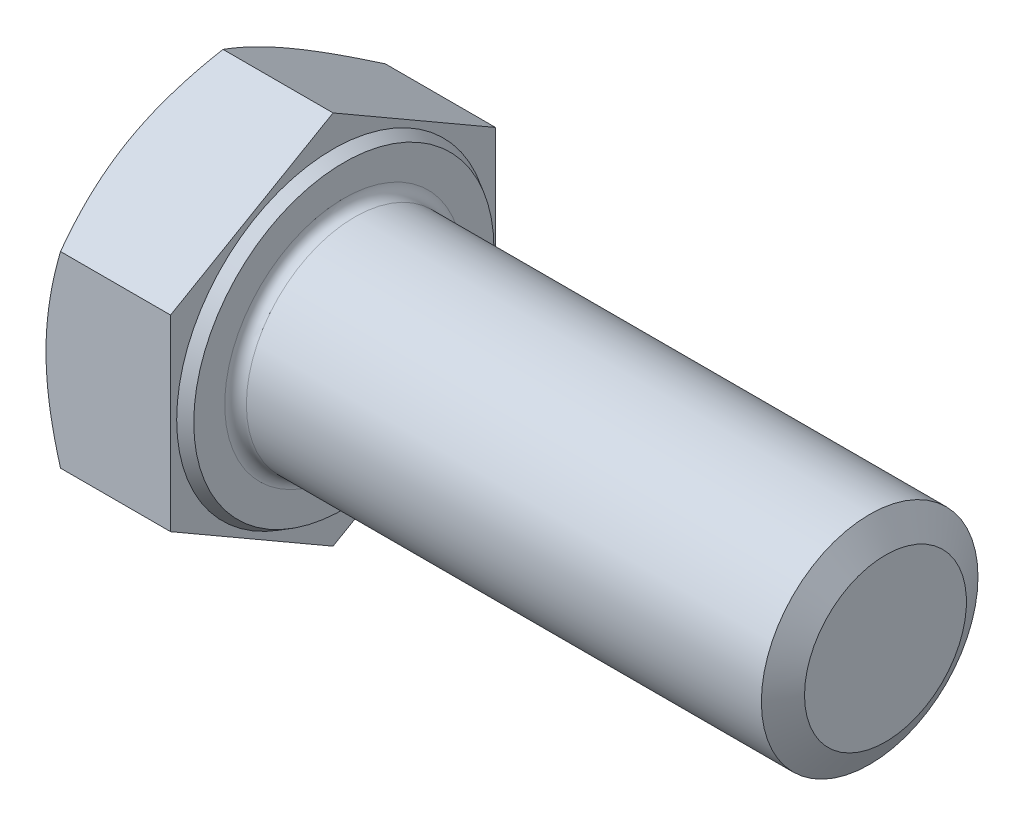
ISO-10303-21;
HEADER;
FILE_DESCRIPTION(('STEP AP214'),'2;1');
FILE_NAME('part.step','',(''),(''),'','','');
FILE_SCHEMA(('AUTOMOTIVE_DESIGN { 1 0 10303 214 1 1 1 1 }'));
ENDSEC;
DATA;
#1=APPLICATION_CONTEXT('core data for automotive mechanical design processes');
#2=APPLICATION_PROTOCOL_DEFINITION('international standard','automotive_design',2000,#1);
#3=PRODUCT_CONTEXT('',#1,'mechanical');
#4=PRODUCT('Part','Part','',(#3));
#5=PRODUCT_RELATED_PRODUCT_CATEGORY('part','',(#4));
#6=PRODUCT_DEFINITION_FORMATION('','',#4);
#7=PRODUCT_DEFINITION_CONTEXT('part definition',#1,'design');
#8=PRODUCT_DEFINITION('design','',#6,#7);
#9=PRODUCT_DEFINITION_SHAPE('','',#8);
#10=(LENGTH_UNIT() NAMED_UNIT(*) SI_UNIT(.MILLI.,.METRE.));
#11=(NAMED_UNIT(*) PLANE_ANGLE_UNIT() SI_UNIT($,.RADIAN.));
#12=(NAMED_UNIT(*) SI_UNIT($,.STERADIAN.) SOLID_ANGLE_UNIT());
#13=UNCERTAINTY_MEASURE_WITH_UNIT(LENGTH_MEASURE(1.E-05),#10,'distance_accuracy_value','');
#14=(GEOMETRIC_REPRESENTATION_CONTEXT(3) GLOBAL_UNCERTAINTY_ASSIGNED_CONTEXT((#13)) GLOBAL_UNIT_ASSIGNED_CONTEXT((#10,
#11,#12)) REPRESENTATION_CONTEXT('',''));
#15=CARTESIAN_POINT('',(0.,0.,0.));
#16=DIRECTION('',(0.,0.,1.));
#17=DIRECTION('',(1.,0.,0.));
#18=AXIS2_PLACEMENT_3D('',#15,#16,#17);
#19=CARTESIAN_POINT('',(0.,0.,0.));
#20=DIRECTION('',(-1.,0.,0.));
#21=DIRECTION('',(0.,0.,1.));
#22=AXIS2_PLACEMENT_3D('',#19,#20,#21);
#23=CYLINDRICAL_SURFACE('',#22,6.);
#24=CARTESIAN_POINT('',(8.1,0.,0.));
#25=DIRECTION('',(1.,0.,0.));
#26=DIRECTION('',(0.,0.,-1.));
#27=AXIS2_PLACEMENT_3D('',#24,#25,#26);
#28=CIRCLE('',#27,6.);
#29=CARTESIAN_POINT('',(8.1,0.,-6.));
#30=VERTEX_POINT('',#29);
#31=EDGE_CURVE('E11',#30,#30,#28,.T.);
#32=ORIENTED_EDGE('',*,*,#31,.T.);
#33=EDGE_LOOP('',(#32));
#34=FACE_BOUND('',#33,.T.);
#35=CARTESIAN_POINT('',(36.625,0.,0.));
#36=DIRECTION('',(-1.,0.,0.));
#37=DIRECTION('',(0.,0.,1.));
#38=AXIS2_PLACEMENT_3D('',#35,#36,#37);
#39=CIRCLE('',#38,6.);
#40=CARTESIAN_POINT('',(36.625,0.,6.));
#41=VERTEX_POINT('',#40);
#42=EDGE_CURVE('E435',#41,#41,#39,.T.);
#43=ORIENTED_EDGE('',*,*,#42,.T.);
#44=EDGE_LOOP('',(#43));
#45=FACE_BOUND('',#44,.T.);
#46=ADVANCED_FACE('F40',(#34,#45),#23,.T.);
#47=CARTESIAN_POINT('',(7.5,5.19615242270663,-9.));
#48=DIRECTION('',(0.,-0.866025403784438,0.500000000000001));
#49=DIRECTION('',(0.,-0.500000000000001,-0.866025403784438));
#50=AXIS2_PLACEMENT_3D('',#47,#48,#49);
#51=PLANE('',#50);
#52=DIRECTION('',(0.,0.500000000000001,0.866025403784438));
#53=VECTOR('',#52,1.);
#54=CARTESIAN_POINT('',(6.9,5.19615242270663,-9.));
#55=LINE('',#54,#53);
#56=CARTESIAN_POINT('',(6.9,5.19615242270666,-9.));
#57=VERTEX_POINT('',#56);
#58=CARTESIAN_POINT('',(6.9,10.3923048454133,0.));
#59=VERTEX_POINT('',#58);
#60=EDGE_CURVE('E117',#57,#59,#55,.T.);
#61=ORIENTED_EDGE('',*,*,#60,.F.);
#62=DIRECTION('',(-1.,0.,0.));
#63=VECTOR('',#62,1.);
#64=CARTESIAN_POINT('',(7.5,5.19615242270663,-9.));
#65=LINE('',#64,#63);
#66=CARTESIAN_POINT('',(0.803847577293361,5.19615242270663,-9.));
#67=VERTEX_POINT('',#66);
#68=EDGE_CURVE('E301',#57,#67,#65,.T.);
#69=ORIENTED_EDGE('',*,*,#68,.T.);
#70=CARTESIAN_POINT('',(0.803914245071137,10.3924203154671,0.000199999999999553));
#71=CARTESIAN_POINT('',(0.737982001874058,10.2782163639798,-0.197607046401217));
#72=CARTESIAN_POINT('',(0.675041409210316,10.1635669787649,-0.396185606649946));
#73=CARTESIAN_POINT('',(0.55596899765554,9.93333715083391,-0.79495536604421));
#74=CARTESIAN_POINT('',(0.499840117752065,9.81775632901308,-0.995147221818451));
#75=CARTESIAN_POINT('',(0.395151960728965,9.58544915100229,-1.3975150570961));
#76=CARTESIAN_POINT('',(0.346610772912788,9.46872074181187,-1.5996945925006));
#77=CARTESIAN_POINT('',(0.258148516787922,9.23447001335914,-2.00542875589075));
#78=CARTESIAN_POINT('',(0.218225687483276,9.11694786135375,-2.20898309417891));
#79=CARTESIAN_POINT('',(0.148684674147116,8.88408932604663,-2.61230590830691));
#80=CARTESIAN_POINT('',(0.118837502847801,8.76877014301848,-2.812044592399));
#81=CARTESIAN_POINT('',(0.0687933098590831,8.53761579013205,-3.212415675989));
#82=CARTESIAN_POINT('',(0.0485954355375411,8.42178066677662,-3.41304799494161));
#83=CARTESIAN_POINT('',(0.0183543473973483,8.18990950036672,-3.81466063597382));
#84=CARTESIAN_POINT('',(0.00829960958430445,8.07387383570154,-4.01564030266394));
#85=CARTESIAN_POINT('',(-0.00143766485491709,7.84169571742974,-4.41778459991642));
#86=CARTESIAN_POINT('',(-0.00112052193524382,7.72555326723328,-4.61894922457222));
#87=CARTESIAN_POINT('',(0.00916395215317249,7.50842142195782,-4.9950326125305));
#88=CARTESIAN_POINT('',(0.0178767400303962,7.40741671639994,-5.16997789436029));
#89=CARTESIAN_POINT('',(0.0429773400653688,7.20564389241818,-5.51945867708335));
#90=CARTESIAN_POINT('',(0.0593656695806683,7.10487579040239,-5.69399414955697));
#91=CARTESIAN_POINT('',(0.119656556235829,6.8029615939808,-6.21692487728551));
#92=CARTESIAN_POINT('',(0.174677482341127,6.60234990505054,-6.56439451510492));
#93=CARTESIAN_POINT('',(0.312230476325149,6.1989985076226,-7.263019628754));
#94=CARTESIAN_POINT('',(0.395345618627105,5.99631027619253,-7.61408594368717));
#95=CARTESIAN_POINT('',(0.583982539436458,5.59395639760763,-8.31098330401861));
#96=CARTESIAN_POINT('',(0.689460012893353,5.39428559809852,-8.65682327355628));
#97=CARTESIAN_POINT('',(0.803914245071127,5.19603695265279,-9.0002));
#98=B_SPLINE_CURVE_WITH_KNOTS('',3,(#70,#71,#72,#73,#74,#75,#76,#77,#78,#79,#80,#81,#82,#83,#84,
#85,#86,#87,#88,#89,#90,#91,#92,#93,#94,#95,#96,#97),.UNSPECIFIED.,.F.,.F.,(4,2,2,2,2,2,2,2,2,2,
2,2,2,4),(0.,0.713219249102579,1.42674513853509,2.14194697262263,2.85700253034481,
3.55449749123034,4.25193080859215,4.94857085059646,5.64518936892663,6.25162976378284,
6.85811104066341,8.07193747617895,9.31268391793542,10.5509947443908),.UNSPECIFIED.);
#99=CARTESIAN_POINT('',(0.,7.79422863405994,-4.50000000000001));
#100=VERTEX_POINT('',#99);
#101=EDGE_CURVE('E226',#100,#67,#98,.T.);
#102=ORIENTED_EDGE('',*,*,#101,.F.);
#103=CARTESIAN_POINT('',(0.803847577293371,10.3923048454133,0.));
#104=VERTEX_POINT('',#103);
#105=EDGE_CURVE('E63',#104,#100,#98,.T.);
#106=ORIENTED_EDGE('',*,*,#105,.F.);
#107=DIRECTION('',(-1.,0.,0.));
#108=VECTOR('',#107,1.);
#109=CARTESIAN_POINT('',(7.5,10.3923048454133,0.));
#110=LINE('',#109,#108);
#111=EDGE_CURVE('E136',#59,#104,#110,.T.);
#112=ORIENTED_EDGE('',*,*,#111,.F.);
#113=EDGE_LOOP('',(#61,#69,#102,#106,#112));
#114=FACE_BOUND('',#113,.T.);
#115=ADVANCED_FACE('F169',(#114),#51,.F.);
#116=CARTESIAN_POINT('',(7.5,10.3923048454133,0.));
#117=DIRECTION('',(0.,-0.866025403784438,-0.500000000000001));
#118=DIRECTION('',(0.,0.500000000000001,-0.866025403784438));
#119=AXIS2_PLACEMENT_3D('',#116,#117,#118);
#120=PLANE('',#119);
#121=DIRECTION('',(0.,-0.500000000000001,0.866025403784438));
#122=VECTOR('',#121,1.);
#123=CARTESIAN_POINT('',(6.9,10.3923048454133,0.));
#124=LINE('',#123,#122);
#125=CARTESIAN_POINT('',(6.9,5.19615242270667,8.99999999999999));
#126=VERTEX_POINT('',#125);
#127=EDGE_CURVE('E111',#59,#126,#124,.T.);
#128=ORIENTED_EDGE('',*,*,#127,.F.);
#129=ORIENTED_EDGE('',*,*,#111,.T.);
#130=CARTESIAN_POINT('',(0.803914245071126,5.1960369526528,9.00019999999999));
#131=CARTESIAN_POINT('',(0.737982001874048,5.31024090414014,8.80239295359878));
#132=CARTESIAN_POINT('',(0.675041409210307,5.42489028935504,8.60381439335005));
#133=CARTESIAN_POINT('',(0.555968997655532,5.655120117286,8.20504463395579));
#134=CARTESIAN_POINT('',(0.499840117752059,5.77070093910683,8.00485277818155));
#135=CARTESIAN_POINT('',(0.395151960728959,6.00300811711762,7.6024849429039));
#136=CARTESIAN_POINT('',(0.346610772912783,6.11973652630804,7.4003054074994));
#137=CARTESIAN_POINT('',(0.258148516787918,6.35398725476078,6.99457124410925));
#138=CARTESIAN_POINT('',(0.218225687483271,6.47150940676616,6.79101690582109));
#139=CARTESIAN_POINT('',(0.148684674147113,6.70436794207329,6.38769409169308));
#140=CARTESIAN_POINT('',(0.118837502847798,6.81968712510144,6.18795540760099));
#141=CARTESIAN_POINT('',(0.0687933098590813,7.05084147798786,5.787584324011));
#142=CARTESIAN_POINT('',(0.0485954355375398,7.16667660134329,5.58695200505839));
#143=CARTESIAN_POINT('',(0.0183543473973482,7.39854776775319,5.18533936402618));
#144=CARTESIAN_POINT('',(0.00829960958430498,7.51458343241837,4.98435969733606));
#145=CARTESIAN_POINT('',(-0.00143766485491513,7.74676155069017,4.58221540008358));
#146=CARTESIAN_POINT('',(-0.00112052193524111,7.86290400088663,4.38105077542778));
#147=CARTESIAN_POINT('',(0.00916395215317575,8.08003584616209,4.0049673874695));
#148=CARTESIAN_POINT('',(0.0178767400303993,8.18104055171997,3.83002210563971));
#149=CARTESIAN_POINT('',(0.0429773400653724,8.38281337570173,3.48054132291665));
#150=CARTESIAN_POINT('',(0.0593656695806726,8.48358147771751,3.30600585044303));
#151=CARTESIAN_POINT('',(0.119656556235834,8.78549567413911,2.7830751227145));
#152=CARTESIAN_POINT('',(0.174677482341134,8.98610736306937,2.43560548489509));
#153=CARTESIAN_POINT('',(0.312230476325157,9.3894587604973,1.736980371246));
#154=CARTESIAN_POINT('',(0.395345618627113,9.59214699192738,1.38591405631283));
#155=CARTESIAN_POINT('',(0.583982539436468,9.99450087051227,0.689016695981395));
#156=CARTESIAN_POINT('',(0.689460012893363,10.1941716700214,0.343176726443721));
#157=CARTESIAN_POINT('',(0.803914245071137,10.3924203154671,-0.00020000000000002));
#158=B_SPLINE_CURVE_WITH_KNOTS('',3,(#130,#131,#132,#133,#134,#135,#136,#137,#138,#139,#140,
#141,#142,#143,#144,#145,#146,#147,#148,#149,#150,#151,#152,#153,#154,#155,#156,#157),
.UNSPECIFIED.,.F.,.F.,(4,2,2,2,2,2,2,2,2,2,2,2,2,4),(0.,0.713219249102577,1.42674513853509,
2.14194697262263,2.8570025303448,3.55449749123034,4.25193080859215,4.94857085059645,
5.64518936892662,6.25162976378283,6.8581110406634,8.07193747617894,9.31268391793542,
10.5509947443908),.UNSPECIFIED.);
#159=CARTESIAN_POINT('',(0.,7.79422863405994,4.50000000000001));
#160=VERTEX_POINT('',#159);
#161=EDGE_CURVE('E238',#160,#104,#158,.T.);
#162=ORIENTED_EDGE('',*,*,#161,.F.);
#163=CARTESIAN_POINT('',(0.803847577293361,5.19615242270664,8.99999999999999));
#164=VERTEX_POINT('',#163);
#165=EDGE_CURVE('E135',#164,#160,#158,.T.);
#166=ORIENTED_EDGE('',*,*,#165,.F.);
#167=DIRECTION('',(-1.,0.,0.));
#168=VECTOR('',#167,1.);
#169=CARTESIAN_POINT('',(7.5,5.19615242270664,8.99999999999999));
#170=LINE('',#169,#168);
#171=EDGE_CURVE('E126',#126,#164,#170,.T.);
#172=ORIENTED_EDGE('',*,*,#171,.F.);
#173=EDGE_LOOP('',(#128,#129,#162,#166,#172));
#174=FACE_BOUND('',#173,.T.);
#175=ADVANCED_FACE('F133',(#174),#120,.F.);
#176=CARTESIAN_POINT('',(7.5,5.19615242270664,8.99999999999999));
#177=DIRECTION('',(0.,0.,-1.));
#178=DIRECTION('',(0.,1.,0.));
#179=AXIS2_PLACEMENT_3D('',#176,#177,#178);
#180=PLANE('',#179);
#181=DIRECTION('',(0.,-1.,0.));
#182=VECTOR('',#181,1.);
#183=CARTESIAN_POINT('',(6.9,5.19615242270664,8.99999999999999));
#184=LINE('',#183,#182);
#185=CARTESIAN_POINT('',(6.9,-5.19615242270658,9.00000000000005));
#186=VERTEX_POINT('',#185);
#187=EDGE_CURVE('E114',#126,#186,#184,.T.);
#188=ORIENTED_EDGE('',*,*,#187,.F.);
#189=ORIENTED_EDGE('',*,*,#171,.T.);
#190=CARTESIAN_POINT('',(4.50308345606076,-14.1853984750485,9.00000000000001));
#191=CARTESIAN_POINT('',(4.31054430913193,-13.790349961944,9.00000000000001));
#192=CARTESIAN_POINT('',(4.11978648036005,-13.3944187289972,9.00000000000001));
#193=CARTESIAN_POINT('',(3.7428309102861,-12.6003222353684,9.00000000000001));
#194=CARTESIAN_POINT('',(3.55663384534687,-12.2021566539649,9.00000000000001));
#195=CARTESIAN_POINT('',(3.18890856692112,-11.4011784042428,9.00000000000001));
#196=CARTESIAN_POINT('',(3.00740939394886,-10.998352359037,9.00000000000001));
#197=CARTESIAN_POINT('',(2.65153988968444,-10.1895752731495,9.00000000000001));
#198=CARTESIAN_POINT('',(2.47716923625494,-9.78362437466714,9.00000000000001));
#199=CARTESIAN_POINT('',(2.13161245153417,-8.95398189745987,9.00000000000001));
#200=CARTESIAN_POINT('',(1.96074001614282,-8.53015895835005,9.));
#201=CARTESIAN_POINT('',(1.63138410189174,-7.67764040846506,9.));
#202=CARTESIAN_POINT('',(1.47290198123409,-7.24894426938237,9.));
#203=CARTESIAN_POINT('',(1.17232155247292,-6.3867236346642,9.));
#204=CARTESIAN_POINT('',(1.0301919456619,-5.9532101650265,9.));
#205=CARTESIAN_POINT('',(0.766724668982641,-5.07998336306543,9.));
#206=CARTESIAN_POINT('',(0.645380685897053,-4.64027195731315,9.));
#207=CARTESIAN_POINT('',(0.429822600187391,-3.75682505840832,9.));
#208=CARTESIAN_POINT('',(0.335452586452969,-3.31312863839346,9.));
#209=CARTESIAN_POINT('',(0.21809010986241,-2.64336713224846,9.));
#210=CARTESIAN_POINT('',(0.182999861987042,-2.41939560592134,9.));
#211=CARTESIAN_POINT('',(0.121565667139726,-1.97026354213495,9.));
#212=CARTESIAN_POINT('',(0.0952208698915701,-1.74510312242951,9.));
#213=CARTESIAN_POINT('',(0.052145147004904,-1.29693480613699,9.));
#214=CARTESIAN_POINT('',(0.0352889796574883,-1.0739389989918,9.));
#215=CARTESIAN_POINT('',(0.0110310637867448,-0.62743359719944,9.));
#216=CARTESIAN_POINT('',(0.0036291519847982,-0.403924011492213,9.));
#217=CARTESIAN_POINT('',(-0.0015426237841411,0.0432079406441309,9.));
#218=CARTESIAN_POINT('',(0.000687480723093987,0.26683030670172,9.));
#219=CARTESIAN_POINT('',(0.0147226079643581,0.7137768781914,9.));
#220=CARTESIAN_POINT('',(0.0265280662822126,0.937101069596568,9.));
#221=CARTESIAN_POINT('',(0.0656502904232104,1.46707212508445,9.));
#222=CARTESIAN_POINT('',(0.0971347684278848,1.7734184568423,9.));
#223=CARTESIAN_POINT('',(0.176454334209292,2.38397028666911,9.));
#224=CARTESIAN_POINT('',(0.224291458828894,2.68817551322792,9.));
#225=CARTESIAN_POINT('',(0.389806404498592,3.59715813833383,9.));
#226=CARTESIAN_POINT('',(0.529461898664753,4.19799413397006,8.99999999999999));
#227=CARTESIAN_POINT('',(0.773331874087605,5.09670707135546,8.99999999999999));
#228=CARTESIAN_POINT('',(0.861532433522248,5.39919911344215,8.99999999999999));
#229=CARTESIAN_POINT('',(1.04752099468879,6.00125026931418,8.99999999999999));
#230=CARTESIAN_POINT('',(1.14530906486314,6.30080936214526,8.99999999999999));
#231=CARTESIAN_POINT('',(1.34886866345678,6.89708059643013,8.99999999999999));
#232=CARTESIAN_POINT('',(1.45463788009347,7.19379353443469,8.99999999999999));
#233=CARTESIAN_POINT('',(1.67287302313914,7.7847328830015,8.99999999999999));
#234=CARTESIAN_POINT('',(1.78533883831152,8.07895933477388,8.99999999999999));
#235=CARTESIAN_POINT('',(2.07523735650255,8.81619445838357,8.99999999999999));
#236=CARTESIAN_POINT('',(2.25629467397396,9.25777585340509,8.99999999999999));
#237=CARTESIAN_POINT('',(2.62827522661661,10.1367776603819,8.99999999999999));
#238=CARTESIAN_POINT('',(2.81919929109125,10.5741977189049,8.99999999999999));
#239=CARTESIAN_POINT('',(3.20877963784732,11.4457286588119,8.99999999999999));
#240=CARTESIAN_POINT('',(3.40743823524847,11.8798385021484,8.99999999999999));
#241=CARTESIAN_POINT('',(3.81079737629818,12.7452179558959,8.99999999999999));
#242=CARTESIAN_POINT('',(4.01549773929349,13.1764876507589,8.99999999999999));
#243=CARTESIAN_POINT('',(4.43000777933055,14.0372827230624,8.99999999999999));
#244=CARTESIAN_POINT('',(4.63982402654445,14.4668049304786,8.99999999999999));
#245=CARTESIAN_POINT('',(5.06336871777018,15.3239162782486,8.99999999999999));
#246=CARTESIAN_POINT('',(5.27709718538548,15.7515054069201,8.99999999999999));
#247=CARTESIAN_POINT('',(5.70771290050867,16.6049951511436,8.99999999999999));
#248=CARTESIAN_POINT('',(5.92459959319523,17.0308960469429,8.99999999999999));
#249=CARTESIAN_POINT('',(6.36101693702058,17.8813418325907,8.99999999999999));
#250=CARTESIAN_POINT('',(6.58054759918212,18.3058867167768,8.99999999999999));
#251=CARTESIAN_POINT('',(7.20096689804886,19.4981240202845,8.99999999999999));
#252=CARTESIAN_POINT('',(7.60436223876306,20.264511846152,8.99999999999998));
#253=CARTESIAN_POINT('',(8.41646748159571,21.794506601112,8.99999999999998));
#254=CARTESIAN_POINT('',(8.82517763678693,22.5581133955489,8.99999999999998));
#255=CARTESIAN_POINT('',(9.645389925806,24.0808854326838,8.99999999999998));
#256=CARTESIAN_POINT('',(10.0568800853251,24.8400571295377,8.99999999999998));
#257=CARTESIAN_POINT('',(10.6764233722193,25.977523198369,8.99999999999998));
#258=CARTESIAN_POINT('',(10.883315594978,26.3564507974704,8.99999999999998));
#259=CARTESIAN_POINT('',(11.2977907149855,27.1139273842089,8.99999999999998));
#260=CARTESIAN_POINT('',(11.5053736112211,27.4924763724004,8.99999999999998));
#261=CARTESIAN_POINT('',(11.7132605849971,27.870858343354,8.99999999999998));
#262=B_SPLINE_CURVE_WITH_KNOTS('',3,(#190,#191,#192,#193,#194,#195,#196,#197,#198,#199,#200,
#201,#202,#203,#204,#205,#206,#207,#208,#209,#210,#211,#212,#213,#214,#215,#216,#217,#218,#219,
#220,#221,#222,#223,#224,#225,#226,#227,#228,#229,#230,#231,#232,#233,#234,#235,#236,#237,#238,
#239,#240,#241,#242,#243,#244,#245,#246,#247,#248,#249,#250,#251,#252,#253,#254,#255,#256,#257,
#258,#259,#260,#261),.UNSPECIFIED.,.F.,.F.,(4,2,2,2,2,2,2,2,2,2,2,2,2,2,2,2,2,2,2,2,2,2,2,2,2,2,
2,2,2,2,2,2,2,2,2,4),(0.,1.3184276523281,2.63704965842302,3.96247407975987,5.28783853889641,
6.65860359348417,8.02951869858867,9.39776461460017,10.7655942135616,12.1253499558398,
12.8053173295708,13.4852185741162,14.1559216158064,14.8266130740413,15.497302337092,
16.1680221115772,17.0913849258576,18.0148627937263,19.8627426236502,20.8079230607687,
21.7531102457472,22.6980246953435,23.6429234534266,25.0745302518135,26.5062575735559,
27.9384167887983,29.3705332247166,30.804597376367,32.2386701829631,33.6724940274114,
35.1063238515574,37.7045032698604,40.3028068606691,42.8933552338532,44.1885437504926,
45.4837303681959),.UNSPECIFIED.);
#263=CARTESIAN_POINT('',(0.,0.,9.));
#264=VERTEX_POINT('',#263);
#265=EDGE_CURVE('E244',#264,#164,#262,.T.);
#266=ORIENTED_EDGE('',*,*,#265,.F.);
#267=CARTESIAN_POINT('',(0.803847577293356,-5.19615242270661,9.));
#268=VERTEX_POINT('',#267);
#269=EDGE_CURVE('E300',#268,#264,#262,.T.);
#270=ORIENTED_EDGE('',*,*,#269,.F.);
#271=DIRECTION('',(-1.,0.,0.));
#272=VECTOR('',#271,1.);
#273=CARTESIAN_POINT('',(7.5,-5.19615242270661,9.));
#274=LINE('',#273,#272);
#275=EDGE_CURVE('E129',#186,#268,#274,.T.);
#276=ORIENTED_EDGE('',*,*,#275,.F.);
#277=EDGE_LOOP('',(#188,#189,#266,#270,#276));
#278=FACE_BOUND('',#277,.T.);
#279=ADVANCED_FACE('F124',(#278),#180,.F.);
#280=CARTESIAN_POINT('',(7.5,-10.3923048454133,0.));
#281=DIRECTION('',(0.,0.866025403784438,-0.500000000000001));
#282=DIRECTION('',(0.,0.500000000000001,0.866025403784438));
#283=AXIS2_PLACEMENT_3D('',#280,#281,#282);
#284=PLANE('',#283);
#285=DIRECTION('',(0.,-0.500000000000001,-0.866025403784438));
#286=VECTOR('',#285,1.);
#287=CARTESIAN_POINT('',(6.9,-10.3923048454133,0.));
#288=LINE('',#287,#286);
#289=CARTESIAN_POINT('',(6.9,-10.3923048454133,0.));
#290=VERTEX_POINT('',#289);
#291=EDGE_CURVE('E130',#186,#290,#288,.T.);
#292=ORIENTED_EDGE('',*,*,#291,.F.);
#293=ORIENTED_EDGE('',*,*,#275,.T.);
#294=CARTESIAN_POINT('',(0.803914245071125,-10.3924203154671,-0.000199999999997662));
#295=CARTESIAN_POINT('',(0.737982001874047,-10.2782163639797,0.197607046401218));
#296=CARTESIAN_POINT('',(0.675041409210304,-10.1635669787649,0.396185606649947));
#297=CARTESIAN_POINT('',(0.555968997655528,-9.9333371508339,0.794955366044211));
#298=CARTESIAN_POINT('',(0.499840117752054,-9.81775632901307,0.995147221818451));
#299=CARTESIAN_POINT('',(0.395151960728955,-9.58544915100227,1.3975150570961));
#300=CARTESIAN_POINT('',(0.346610772912779,-9.46872074181185,1.5996945925006));
#301=CARTESIAN_POINT('',(0.258148516787913,-9.23447001335912,2.00542875589074));
#302=CARTESIAN_POINT('',(0.218225687483267,-9.11694786135373,2.20898309417891));
#303=CARTESIAN_POINT('',(0.148684674147107,-8.88408932604661,2.61230590830691));
#304=CARTESIAN_POINT('',(0.118837502847792,-8.76877014301846,2.812044592399));
#305=CARTESIAN_POINT('',(0.0687933098590734,-8.53761579013204,3.21241567598899));
#306=CARTESIAN_POINT('',(0.0485954355375317,-8.42178066677661,3.4130479949416));
#307=CARTESIAN_POINT('',(0.0183543473973391,-8.1899095003667,3.81466063597382));
#308=CARTESIAN_POINT('',(0.00829960958429512,-8.07387383570152,4.01564030266393));
#309=CARTESIAN_POINT('',(-0.00143766485492578,-7.84169571742972,4.41778459991642));
#310=CARTESIAN_POINT('',(-0.00112052193525189,-7.72555326723327,4.61894922457222));
#311=CARTESIAN_POINT('',(0.00916395215316455,-7.50842142195781,4.9950326125305));
#312=CARTESIAN_POINT('',(0.0178767400303879,-7.40741671639992,5.16997789436029));
#313=CARTESIAN_POINT('',(0.0429773400653603,-7.20564389241816,5.51945867708334));
#314=CARTESIAN_POINT('',(0.0593656695806599,-7.10487579040238,5.69399414955697));
#315=CARTESIAN_POINT('',(0.119656556235821,-6.80296159398078,6.2169248772855));
#316=CARTESIAN_POINT('',(0.17467748234112,-6.60234990505052,6.56439451510491));
#317=CARTESIAN_POINT('',(0.312230476325143,-6.19899850762259,7.263019628754));
#318=CARTESIAN_POINT('',(0.395345618627098,-5.99631027619251,7.61408594368717));
#319=CARTESIAN_POINT('',(0.583982539436452,-5.59395639760761,8.31098330401861));
#320=CARTESIAN_POINT('',(0.689460012893347,-5.39428559809851,8.65682327355628));
#321=CARTESIAN_POINT('',(0.803914245071122,-5.19603695265277,9.0002));
#322=B_SPLINE_CURVE_WITH_KNOTS('',3,(#294,#295,#296,#297,#298,#299,#300,#301,#302,#303,#304,
#305,#306,#307,#308,#309,#310,#311,#312,#313,#314,#315,#316,#317,#318,#319,#320,#321),
.UNSPECIFIED.,.F.,.F.,(4,2,2,2,2,2,2,2,2,2,2,2,2,4),(0.,0.713219249102577,1.42674513853509,
2.14194697262263,2.8570025303448,3.55449749123034,4.25193080859215,4.94857085059645,
5.64518936892662,6.25162976378284,6.85811104066341,8.07193747617894,9.31268391793542,
10.5509947443908),.UNSPECIFIED.);
#323=CARTESIAN_POINT('',(0.,-7.79422863405994,4.50000000000001));
#324=VERTEX_POINT('',#323);
#325=EDGE_CURVE('E299',#324,#268,#322,.T.);
#326=ORIENTED_EDGE('',*,*,#325,.F.);
#327=CARTESIAN_POINT('',(0.80384757729336,-10.3923048454133,0.));
#328=VERTEX_POINT('',#327);
#329=EDGE_CURVE('E232',#328,#324,#322,.T.);
#330=ORIENTED_EDGE('',*,*,#329,.F.);
#331=DIRECTION('',(-1.,0.,0.));
#332=VECTOR('',#331,1.);
#333=CARTESIAN_POINT('',(7.5,-10.3923048454133,0.));
#334=LINE('',#333,#332);
#335=EDGE_CURVE('E140',#290,#328,#334,.T.);
#336=ORIENTED_EDGE('',*,*,#335,.F.);
#337=EDGE_LOOP('',(#292,#293,#326,#330,#336));
#338=FACE_BOUND('',#337,.T.);
#339=ADVANCED_FACE('F256',(#338),#284,.F.);
#340=CARTESIAN_POINT('',(7.5,-5.19615242270664,-9.00000000000001));
#341=DIRECTION('',(0.,0.866025403784439,0.499999999999999));
#342=DIRECTION('',(0.,-0.499999999999999,0.86602540378444));
#343=AXIS2_PLACEMENT_3D('',#340,#341,#342);
#344=PLANE('',#343);
#345=DIRECTION('',(0.,0.499999999999999,-0.86602540378444));
#346=VECTOR('',#345,1.);
#347=CARTESIAN_POINT('',(6.9,-5.19615242270664,-9.00000000000001));
#348=LINE('',#347,#346);
#349=CARTESIAN_POINT('',(6.9,-5.19615242270664,-9.00000000000001));
#350=VERTEX_POINT('',#349);
#351=EDGE_CURVE('E55',#290,#350,#348,.T.);
#352=ORIENTED_EDGE('',*,*,#351,.F.);
#353=ORIENTED_EDGE('',*,*,#335,.T.);
#354=CARTESIAN_POINT('',(0.803914245071135,-5.1960369526528,-9.00020000000001));
#355=CARTESIAN_POINT('',(0.737982001874056,-5.31024090414015,-8.80239295359879));
#356=CARTESIAN_POINT('',(0.675041409210314,-5.42489028935504,-8.60381439335006));
#357=CARTESIAN_POINT('',(0.555968997655538,-5.655120117286,-8.2050446339558));
#358=CARTESIAN_POINT('',(0.499840117752064,-5.77070093910683,-8.00485277818156));
#359=CARTESIAN_POINT('',(0.395151960728963,-6.00300811711763,-7.60248494290391));
#360=CARTESIAN_POINT('',(0.346610772912786,-6.11973652630805,-7.40030540749941));
#361=CARTESIAN_POINT('',(0.258148516787921,-6.35398725476078,-6.99457124410926));
#362=CARTESIAN_POINT('',(0.218225687483275,-6.47150940676616,-6.79101690582109));
#363=CARTESIAN_POINT('',(0.148684674147116,-6.70436794207328,-6.38769409169309));
#364=CARTESIAN_POINT('',(0.118837502847801,-6.81968712510143,-6.187955407601));
#365=CARTESIAN_POINT('',(0.0687933098590818,-7.05084147798786,-5.78758432401101));
#366=CARTESIAN_POINT('',(0.0485954355375396,-7.16667660134328,-5.5869520050584));
#367=CARTESIAN_POINT('',(0.0183543473973467,-7.39854776775319,-5.18533936402618));
#368=CARTESIAN_POINT('',(0.00829960958430304,-7.51458343241837,-4.98435969733607));
#369=CARTESIAN_POINT('',(-0.00143766485491819,-7.74676155069016,-4.58221540008358));
#370=CARTESIAN_POINT('',(-0.00112052193524485,-7.86290400088662,-4.38105077542778));
#371=CARTESIAN_POINT('',(0.00916395215317196,-8.08003584616208,-4.0049673874695));
#372=CARTESIAN_POINT('',(0.017876740030396,-8.18104055171996,-3.83002210563971));
#373=CARTESIAN_POINT('',(0.0429773400653687,-8.38281337570172,-3.48054132291665));
#374=CARTESIAN_POINT('',(0.0593656695806679,-8.48358147771751,-3.30600585044303));
#375=CARTESIAN_POINT('',(0.119656556235828,-8.7854956741391,-2.78307512271449));
#376=CARTESIAN_POINT('',(0.174677482341126,-8.98610736306936,-2.43560548489508));
#377=CARTESIAN_POINT('',(0.312230476325148,-9.38945876049729,-1.736980371246));
#378=CARTESIAN_POINT('',(0.395345618627103,-9.59214699192736,-1.38591405631283));
#379=CARTESIAN_POINT('',(0.583982539436456,-9.99450087051226,-0.689016695981392));
#380=CARTESIAN_POINT('',(0.689460012893351,-10.1941716700214,-0.343176726443719));
#381=CARTESIAN_POINT('',(0.803914245071125,-10.3924203154671,0.000200000000002341));
#382=B_SPLINE_CURVE_WITH_KNOTS('',3,(#354,#355,#356,#357,#358,#359,#360,#361,#362,#363,#364,
#365,#366,#367,#368,#369,#370,#371,#372,#373,#374,#375,#376,#377,#378,#379,#380,#381),
.UNSPECIFIED.,.F.,.F.,(4,2,2,2,2,2,2,2,2,2,2,2,2,4),(0.,0.713219249102577,1.42674513853509,
2.14194697262263,2.85700253034481,3.55449749123034,4.25193080859215,4.94857085059646,
5.64518936892663,6.25162976378284,6.85811104066341,8.07193747617894,9.31268391793542,
10.5509947443908),.UNSPECIFIED.);
#383=CARTESIAN_POINT('',(0.,-7.79422863405996,-4.49999999999999));
#384=VERTEX_POINT('',#383);
#385=EDGE_CURVE('E284',#384,#328,#382,.T.);
#386=ORIENTED_EDGE('',*,*,#385,.F.);
#387=CARTESIAN_POINT('',(0.803847577293113,-5.19615242270703,-9.00000000000001));
#388=VERTEX_POINT('',#387);
#389=EDGE_CURVE('E206',#388,#384,#382,.T.);
#390=ORIENTED_EDGE('',*,*,#389,.F.);
#391=DIRECTION('',(-1.,0.,0.));
#392=VECTOR('',#391,1.);
#393=CARTESIAN_POINT('',(7.5,-5.19615242270664,-9.00000000000001));
#394=LINE('',#393,#392);
#395=EDGE_CURVE('E296',#350,#388,#394,.T.);
#396=ORIENTED_EDGE('',*,*,#395,.F.);
#397=EDGE_LOOP('',(#352,#353,#386,#390,#396));
#398=FACE_BOUND('',#397,.T.);
#399=ADVANCED_FACE('F190',(#398),#344,.F.);
#400=CARTESIAN_POINT('',(7.5,5.19615242270663,-9.));
#401=DIRECTION('',(0.,0.,1.));
#402=DIRECTION('',(0.,-1.,0.));
#403=AXIS2_PLACEMENT_3D('',#400,#401,#402);
#404=PLANE('',#403);
#405=DIRECTION('',(0.,1.,0.));
#406=VECTOR('',#405,1.);
#407=CARTESIAN_POINT('',(6.9,5.19615242270663,-9.));
#408=LINE('',#407,#406);
#409=EDGE_CURVE('E148',#350,#57,#408,.T.);
#410=ORIENTED_EDGE('',*,*,#409,.F.);
#411=ORIENTED_EDGE('',*,*,#395,.T.);
#412=CARTESIAN_POINT('',(4.50308345606078,-14.1853984750485,-9.00000000000001));
#413=CARTESIAN_POINT('',(4.31054430913195,-13.7903499619441,-9.00000000000001));
#414=CARTESIAN_POINT('',(4.11978648036007,-13.3944187289973,-9.00000000000001));
#415=CARTESIAN_POINT('',(3.74283091028612,-12.6003222353684,-9.00000000000001));
#416=CARTESIAN_POINT('',(3.55663384534689,-12.2021566539649,-9.00000000000001));
#417=CARTESIAN_POINT('',(3.18890856692114,-11.4011784042428,-9.00000000000001));
#418=CARTESIAN_POINT('',(3.00740939394888,-10.998352359037,-9.00000000000001));
#419=CARTESIAN_POINT('',(2.65153988968446,-10.1895752731496,-9.00000000000001));
#420=CARTESIAN_POINT('',(2.47716923625496,-9.78362437466717,-9.00000000000001));
#421=CARTESIAN_POINT('',(2.13161245153419,-8.95398189745991,-9.00000000000001));
#422=CARTESIAN_POINT('',(1.96074001614284,-8.53015895835008,-9.00000000000001));
#423=CARTESIAN_POINT('',(1.63138410189175,-7.6776404084651,-9.00000000000001));
#424=CARTESIAN_POINT('',(1.4729019812341,-7.2489442693824,-9.00000000000001));
#425=CARTESIAN_POINT('',(1.17232155247294,-6.38672363466423,-9.00000000000001));
#426=CARTESIAN_POINT('',(1.03019194566191,-5.95321016502653,-9.00000000000001));
#427=CARTESIAN_POINT('',(0.766724668982652,-5.07998336306546,-9.00000000000001));
#428=CARTESIAN_POINT('',(0.645380685897064,-4.64027195731318,-9.00000000000001));
#429=CARTESIAN_POINT('',(0.4298226001874,-3.75682505840834,-9.00000000000001));
#430=CARTESIAN_POINT('',(0.335452586452978,-3.31312863839348,-9.00000000000001));
#431=CARTESIAN_POINT('',(0.218090109862417,-2.64336713224848,-9.00000000000001));
#432=CARTESIAN_POINT('',(0.182999861987049,-2.41939560592137,-9.00000000000001));
#433=CARTESIAN_POINT('',(0.121565667139733,-1.97026354213497,-9.00000000000001));
#434=CARTESIAN_POINT('',(0.0952208698915764,-1.74510312242953,-9.00000000000001));
#435=CARTESIAN_POINT('',(0.0521451470049096,-1.29693480613701,-9.00000000000001));
#436=CARTESIAN_POINT('',(0.0352889796574936,-1.07393899899182,-9.00000000000001));
#437=CARTESIAN_POINT('',(0.0110310637867496,-0.62743359719946,-9.00000000000001));
#438=CARTESIAN_POINT('',(0.00362915198480263,-0.403924011492233,-9.00000000000001));
#439=CARTESIAN_POINT('',(-0.00154262378413751,0.0432079406441114,-9.00000000000001));
#440=CARTESIAN_POINT('',(0.00068748072309709,0.266830306701701,-9.00000000000001));
#441=CARTESIAN_POINT('',(0.014722607964361,0.713776878191381,-9.00000000000001));
#442=CARTESIAN_POINT('',(0.0265280662822158,0.937101069596548,-9.00000000000001));
#443=CARTESIAN_POINT('',(0.0656502904232131,1.46707212508443,-9.00000000000001));
#444=CARTESIAN_POINT('',(0.0971347684278863,1.77341845684228,-9.));
#445=CARTESIAN_POINT('',(0.176454334209293,2.38397028666909,-9.));
#446=CARTESIAN_POINT('',(0.224291458828895,2.6881755132279,-9.));
#447=CARTESIAN_POINT('',(0.389806404498593,3.59715813833381,-9.));
#448=CARTESIAN_POINT('',(0.529461898664751,4.19799413397005,-9.));
#449=CARTESIAN_POINT('',(0.773331874087602,5.09670707135544,-9.));
#450=CARTESIAN_POINT('',(0.861532433522245,5.39919911344212,-9.));
#451=CARTESIAN_POINT('',(1.04752099468878,6.00125026931415,-9.));
#452=CARTESIAN_POINT('',(1.14530906486313,6.30080936214524,-9.));
#453=CARTESIAN_POINT('',(1.34886866345677,6.8970805964301,-9.));
#454=CARTESIAN_POINT('',(1.45463788009346,7.19379353443467,-9.));
#455=CARTESIAN_POINT('',(1.67287302313913,7.78473288300147,-9.));
#456=CARTESIAN_POINT('',(1.78533883831151,8.07895933477385,-9.));
#457=CARTESIAN_POINT('',(2.07523735650254,8.81619445838355,-9.));
#458=CARTESIAN_POINT('',(2.25629467397395,9.25777585340506,-9.));
#459=CARTESIAN_POINT('',(2.6282752266166,10.1367776603819,-9.));
#460=CARTESIAN_POINT('',(2.81919929109125,10.5741977189049,-9.));
#461=CARTESIAN_POINT('',(3.20877963784732,11.4457286588119,-9.));
#462=CARTESIAN_POINT('',(3.40743823524846,11.8798385021483,-9.));
#463=CARTESIAN_POINT('',(3.81079737629817,12.7452179558959,-9.));
#464=CARTESIAN_POINT('',(4.01549773929348,13.1764876507589,-9.));
#465=CARTESIAN_POINT('',(4.43000777933055,14.0372827230624,-9.));
#466=CARTESIAN_POINT('',(4.63982402654444,14.4668049304786,-8.99999999999999));
#467=CARTESIAN_POINT('',(5.06336871777017,15.3239162782486,-8.99999999999999));
#468=CARTESIAN_POINT('',(5.27709718538547,15.7515054069201,-8.99999999999999));
#469=CARTESIAN_POINT('',(5.70771290050866,16.6049951511436,-8.99999999999999));
#470=CARTESIAN_POINT('',(5.92459959319522,17.0308960469429,-8.99999999999999));
#471=CARTESIAN_POINT('',(6.36101693702057,17.8813418325907,-8.99999999999999));
#472=CARTESIAN_POINT('',(6.58054759918211,18.3058867167768,-8.99999999999999));
#473=CARTESIAN_POINT('',(7.20096689804885,19.4981240202845,-8.99999999999999));
#474=CARTESIAN_POINT('',(7.60436223876305,20.264511846152,-8.99999999999999));
#475=CARTESIAN_POINT('',(8.4164674815957,21.794506601112,-8.99999999999999));
#476=CARTESIAN_POINT('',(8.82517763678693,22.5581133955489,-8.99999999999999));
#477=CARTESIAN_POINT('',(9.64538992580601,24.0808854326838,-8.99999999999999));
#478=CARTESIAN_POINT('',(10.0568800853251,24.8400571295377,-8.99999999999999));
#479=CARTESIAN_POINT('',(10.6764233722193,25.977523198369,-8.99999999999999));
#480=CARTESIAN_POINT('',(10.883315594978,26.3564507974704,-8.99999999999999));
#481=CARTESIAN_POINT('',(11.2977907149855,27.113927384209,-8.99999999999999));
#482=CARTESIAN_POINT('',(11.5053736112211,27.4924763724004,-8.99999999999999));
#483=CARTESIAN_POINT('',(11.7132605849971,27.8708583433541,-8.99999999999999));
#484=B_SPLINE_CURVE_WITH_KNOTS('',3,(#412,#413,#414,#415,#416,#417,#418,#419,#420,#421,#422,
#423,#424,#425,#426,#427,#428,#429,#430,#431,#432,#433,#434,#435,#436,#437,#438,#439,#440,#441,
#442,#443,#444,#445,#446,#447,#448,#449,#450,#451,#452,#453,#454,#455,#456,#457,#458,#459,#460,
#461,#462,#463,#464,#465,#466,#467,#468,#469,#470,#471,#472,#473,#474,#475,#476,#477,#478,#479,
#480,#481,#482,#483),.UNSPECIFIED.,.F.,.F.,(4,2,2,2,2,2,2,2,2,2,2,2,2,2,2,2,2,2,2,2,2,2,2,2,2,2,
2,2,2,2,2,2,2,2,2,4),(0.,1.3184276523281,2.63704965842302,3.96247407975987,5.28783853889642,
6.65860359348418,8.02951869858869,9.39776461460019,10.7655942135616,12.1253499558398,
12.8053173295709,13.4852185741162,14.1559216158065,14.8266130740414,15.4973023370921,
16.1680221115773,17.0913849258577,18.0148627937263,19.8627426236502,20.8079230607688,
21.7531102457472,22.6980246953435,23.6429234534266,25.0745302518135,26.506257573556,
27.9384167887983,29.3705332247166,30.804597376367,32.2386701829632,33.6724940274115,
35.1063238515574,37.7045032698604,40.3028068606692,42.8933552338532,44.1885437504927,
45.4837303681959),.UNSPECIFIED.);
#485=CARTESIAN_POINT('',(0.,0.,-9.00000000000001));
#486=VERTEX_POINT('',#485);
#487=EDGE_CURVE('E195',#486,#388,#484,.F.);
#488=ORIENTED_EDGE('',*,*,#487,.F.);
#489=EDGE_CURVE('E203',#67,#486,#484,.F.);
#490=ORIENTED_EDGE('',*,*,#489,.F.);
#491=ORIENTED_EDGE('',*,*,#68,.F.);
#492=EDGE_LOOP('',(#410,#411,#488,#490,#491));
#493=FACE_BOUND('',#492,.T.);
#494=ADVANCED_FACE('F185',(#493),#404,.F.);
#495=CARTESIAN_POINT('',(0.,0.,0.));
#496=DIRECTION('',(1.,0.,0.));
#497=DIRECTION('',(0.,0.,-1.));
#498=AXIS2_PLACEMENT_3D('',#495,#496,#497);
#499=CONICAL_SURFACE('',#498,9.,1.0471975511966);
#500=ORIENTED_EDGE('',*,*,#389,.T.);
#501=CARTESIAN_POINT('',(0.,0.,0.));
#502=DIRECTION('',(1.,0.,0.));
#503=DIRECTION('',(0.,0.,-1.));
#504=AXIS2_PLACEMENT_3D('',#501,#502,#503);
#505=CIRCLE('',#504,9.);
#506=EDGE_CURVE('E138',#384,#486,#505,.T.);
#507=ORIENTED_EDGE('',*,*,#506,.T.);
#508=ORIENTED_EDGE('',*,*,#487,.T.);
#509=EDGE_LOOP('',(#500,#507,#508));
#510=FACE_BOUND('',#509,.T.);
#511=ADVANCED_FACE('F189',(#510),#499,.T.);
#512=ORIENTED_EDGE('',*,*,#329,.T.);
#513=EDGE_CURVE('E146',#324,#384,#505,.T.);
#514=ORIENTED_EDGE('',*,*,#513,.T.);
#515=ORIENTED_EDGE('',*,*,#385,.T.);
#516=EDGE_LOOP('',(#512,#514,#515));
#517=FACE_BOUND('',#516,.T.);
#518=ADVANCED_FACE('F217',(#517),#499,.T.);
#519=ORIENTED_EDGE('',*,*,#269,.T.);
#520=EDGE_CURVE('E280',#264,#324,#505,.T.);
#521=ORIENTED_EDGE('',*,*,#520,.T.);
#522=ORIENTED_EDGE('',*,*,#325,.T.);
#523=EDGE_LOOP('',(#519,#521,#522));
#524=FACE_BOUND('',#523,.T.);
#525=ADVANCED_FACE('F212',(#524),#499,.T.);
#526=ORIENTED_EDGE('',*,*,#265,.T.);
#527=ORIENTED_EDGE('',*,*,#165,.T.);
#528=CARTESIAN_POINT('',(0.,0.,0.));
#529=DIRECTION('',(-1.,0.,0.));
#530=DIRECTION('',(0.,0.,1.));
#531=AXIS2_PLACEMENT_3D('',#528,#529,#530);
#532=CIRCLE('',#531,9.);
#533=EDGE_CURVE('E204',#264,#160,#532,.T.);
#534=ORIENTED_EDGE('',*,*,#533,.F.);
#535=EDGE_LOOP('',(#526,#527,#534));
#536=FACE_BOUND('',#535,.T.);
#537=ADVANCED_FACE('F216',(#536),#499,.T.);
#538=ORIENTED_EDGE('',*,*,#161,.T.);
#539=ORIENTED_EDGE('',*,*,#105,.T.);
#540=EDGE_CURVE('E276',#100,#160,#505,.T.);
#541=ORIENTED_EDGE('',*,*,#540,.T.);
#542=EDGE_LOOP('',(#538,#539,#541));
#543=FACE_BOUND('',#542,.T.);
#544=ADVANCED_FACE('F282',(#543),#499,.T.);
#545=ORIENTED_EDGE('',*,*,#101,.T.);
#546=ORIENTED_EDGE('',*,*,#489,.T.);
#547=EDGE_CURVE('E147',#486,#100,#505,.T.);
#548=ORIENTED_EDGE('',*,*,#547,.T.);
#549=EDGE_LOOP('',(#545,#546,#548));
#550=FACE_BOUND('',#549,.T.);
#551=ADVANCED_FACE('F183',(#550),#499,.T.);
#552=CARTESIAN_POINT('',(0.,10.3923048454133,0.));
#553=DIRECTION('',(1.,0.,0.));
#554=DIRECTION('',(0.,0.,-1.));
#555=AXIS2_PLACEMENT_3D('',#552,#553,#554);
#556=PLANE('',#555);
#557=ORIENTED_EDGE('',*,*,#547,.F.);
#558=ORIENTED_EDGE('',*,*,#506,.F.);
#559=ORIENTED_EDGE('',*,*,#513,.F.);
#560=ORIENTED_EDGE('',*,*,#520,.F.);
#561=ORIENTED_EDGE('',*,*,#533,.T.);
#562=ORIENTED_EDGE('',*,*,#540,.F.);
#563=EDGE_LOOP('',(#557,#558,#559,#560,#561,#562));
#564=FACE_BOUND('',#563,.T.);
#565=ADVANCED_FACE('F180',(#564),#556,.F.);
#566=CARTESIAN_POINT('',(6.9,8.66141016151377,0.));
#567=DIRECTION('',(1.,0.,0.));
#568=DIRECTION('',(0.,0.,-1.));
#569=AXIS2_PLACEMENT_3D('',#566,#567,#568);
#570=PLANE('',#569);
#571=CARTESIAN_POINT('',(6.9,0.,0.));
#572=DIRECTION('',(-1.,0.,0.));
#573=DIRECTION('',(0.,0.,1.));
#574=AXIS2_PLACEMENT_3D('',#571,#572,#573);
#575=CIRCLE('',#574,8.66141016151377);
#576=CARTESIAN_POINT('',(6.9,0.,8.66141016151377));
#577=VERTEX_POINT('',#576);
#578=EDGE_CURVE('E269',#577,#577,#575,.T.);
#579=ORIENTED_EDGE('',*,*,#578,.T.);
#580=EDGE_LOOP('',(#579));
#581=FACE_BOUND('',#580,.T.);
#582=ORIENTED_EDGE('',*,*,#60,.T.);
#583=ORIENTED_EDGE('',*,*,#127,.T.);
#584=ORIENTED_EDGE('',*,*,#187,.T.);
#585=ORIENTED_EDGE('',*,*,#291,.T.);
#586=ORIENTED_EDGE('',*,*,#351,.T.);
#587=ORIENTED_EDGE('',*,*,#409,.T.);
#588=EDGE_LOOP('',(#582,#583,#584,#585,#586,#587));
#589=FACE_BOUND('',#588,.T.);
#590=ADVANCED_FACE('F113',(#581,#589),#570,.T.);
#591=CARTESIAN_POINT('',(6.9,0.,0.));
#592=DIRECTION('',(-1.,0.,0.));
#593=DIRECTION('',(0.,0.,1.));
#594=AXIS2_PLACEMENT_3D('',#591,#592,#593);
#595=CONICAL_SURFACE('',#594,8.66141016151377,0.523598775598305);
#596=CARTESIAN_POINT('',(7.49999999999999,0.,0.));
#597=DIRECTION('',(-1.,0.,0.));
#598=DIRECTION('',(0.,0.,1.));
#599=AXIS2_PLACEMENT_3D('',#596,#597,#598);
#600=CIRCLE('',#599,8.315);
#601=CARTESIAN_POINT('',(7.49999999999999,0.,8.315));
#602=VERTEX_POINT('',#601);
#603=EDGE_CURVE('E434',#602,#602,#600,.T.);
#604=ORIENTED_EDGE('',*,*,#603,.T.);
#605=EDGE_LOOP('',(#604));
#606=FACE_BOUND('',#605,.T.);
#607=ORIENTED_EDGE('',*,*,#578,.F.);
#608=EDGE_LOOP('',(#607));
#609=FACE_BOUND('',#608,.T.);
#610=ADVANCED_FACE('F165',(#606,#609),#595,.T.);
#611=CARTESIAN_POINT('',(7.5,10.3923048454133,0.));
#612=DIRECTION('',(1.,0.,0.));
#613=DIRECTION('',(0.,0.,-1.));
#614=AXIS2_PLACEMENT_3D('',#611,#612,#613);
#615=PLANE('',#614);
#616=CARTESIAN_POINT('',(7.5,0.,0.));
#617=DIRECTION('',(1.,0.,0.));
#618=DIRECTION('',(0.,0.,-1.));
#619=AXIS2_PLACEMENT_3D('',#616,#617,#618);
#620=CIRCLE('',#619,6.6);
#621=CARTESIAN_POINT('',(7.5,0.,-6.6));
#622=VERTEX_POINT('',#621);
#623=EDGE_CURVE('E48',#622,#622,#620,.F.);
#624=ORIENTED_EDGE('',*,*,#623,.T.);
#625=EDGE_LOOP('',(#624));
#626=FACE_BOUND('',#625,.T.);
#627=ORIENTED_EDGE('',*,*,#603,.F.);
#628=EDGE_LOOP('',(#627));
#629=FACE_BOUND('',#628,.T.);
#630=ADVANCED_FACE('F152',(#626,#629),#615,.T.);
#631=CARTESIAN_POINT('',(8.1,0.,0.));
#632=DIRECTION('',(1.,0.,0.));
#633=DIRECTION('',(0.,0.,-1.));
#634=AXIS2_PLACEMENT_3D('',#631,#632,#633);
#635=TOROIDAL_SURFACE('',#634,6.6,0.6);
#636=ORIENTED_EDGE('',*,*,#31,.F.);
#637=EDGE_LOOP('',(#636));
#638=FACE_BOUND('',#637,.T.);
#639=ORIENTED_EDGE('',*,*,#623,.F.);
#640=EDGE_LOOP('',(#639));
#641=FACE_BOUND('',#640,.T.);
#642=ADVANCED_FACE('F42',(#638,#641),#635,.F.);
#643=CARTESIAN_POINT('',(36.625,0.,0.));
#644=DIRECTION('',(-1.,0.,0.));
#645=DIRECTION('',(0.,0.,1.));
#646=AXIS2_PLACEMENT_3D('',#643,#644,#645);
#647=CONICAL_SURFACE('',#646,6.,1.0471975511966);
#648=CARTESIAN_POINT('',(37.5,0.,0.));
#649=DIRECTION('',(-1.,0.,0.));
#650=DIRECTION('',(0.,0.,1.));
#651=AXIS2_PLACEMENT_3D('',#648,#649,#650);
#652=CIRCLE('',#651,4.48445554337723);
#653=CARTESIAN_POINT('',(37.5,0.,4.48445554337723));
#654=VERTEX_POINT('',#653);
#655=EDGE_CURVE('E433',#654,#654,#652,.T.);
#656=ORIENTED_EDGE('',*,*,#655,.T.);
#657=EDGE_LOOP('',(#656));
#658=FACE_BOUND('',#657,.T.);
#659=ORIENTED_EDGE('',*,*,#42,.F.);
#660=EDGE_LOOP('',(#659));
#661=FACE_BOUND('',#660,.T.);
#662=ADVANCED_FACE('F156',(#658,#661),#647,.T.);
#663=CARTESIAN_POINT('',(37.5,0.,0.));
#664=DIRECTION('',(-1.,0.,0.));
#665=DIRECTION('',(0.,0.,1.));
#666=AXIS2_PLACEMENT_3D('',#663,#664,#665);
#667=PLANE('',#666);
#668=ORIENTED_EDGE('',*,*,#655,.F.);
#669=EDGE_LOOP('',(#668));
#670=FACE_BOUND('',#669,.T.);
#671=ADVANCED_FACE('F162',(#670),#667,.F.);
#672=CLOSED_SHELL('',(#46,#115,#175,#279,#339,#399,#494,#511,#518,#525,#537,#544,#551,#565,#590,
#610,#630,#642,#662,#671));
#673=MANIFOLD_SOLID_BREP('B2',#672);
#674=ADVANCED_BREP_SHAPE_REPRESENTATION('',(#18,#673),#14);
#675=SHAPE_DEFINITION_REPRESENTATION(#9,#674);
ENDSEC;
END-ISO-10303-21;
